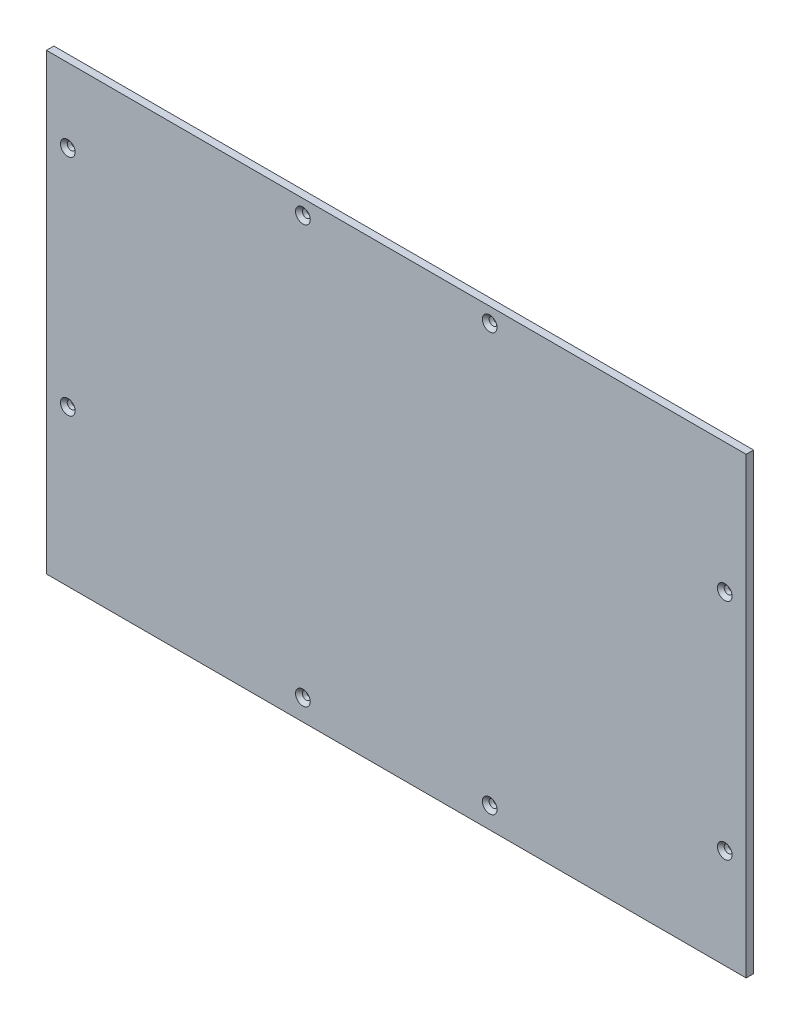
ISO-10303-21;
HEADER;
FILE_DESCRIPTION(('STEP AP214'),'2;1');
FILE_NAME('part.step','',(''),(''),'','','');
FILE_SCHEMA(('AUTOMOTIVE_DESIGN { 1 0 10303 214 1 1 1 1 }'));
ENDSEC;
DATA;
#1=APPLICATION_CONTEXT('core data for automotive mechanical design processes');
#2=APPLICATION_PROTOCOL_DEFINITION('international standard','automotive_design',2000,#1);
#3=PRODUCT_CONTEXT('',#1,'mechanical');
#4=PRODUCT('Part','Part','',(#3));
#5=PRODUCT_RELATED_PRODUCT_CATEGORY('part','',(#4));
#6=PRODUCT_DEFINITION_FORMATION('','',#4);
#7=PRODUCT_DEFINITION_CONTEXT('part definition',#1,'design');
#8=PRODUCT_DEFINITION('design','',#6,#7);
#9=PRODUCT_DEFINITION_SHAPE('','',#8);
#10=(LENGTH_UNIT() NAMED_UNIT(*) SI_UNIT(.MILLI.,.METRE.));
#11=(NAMED_UNIT(*) PLANE_ANGLE_UNIT() SI_UNIT($,.RADIAN.));
#12=(NAMED_UNIT(*) SI_UNIT($,.STERADIAN.) SOLID_ANGLE_UNIT());
#13=UNCERTAINTY_MEASURE_WITH_UNIT(LENGTH_MEASURE(1.E-05),#10,'distance_accuracy_value','');
#14=(GEOMETRIC_REPRESENTATION_CONTEXT(3) GLOBAL_UNCERTAINTY_ASSIGNED_CONTEXT((#13)) GLOBAL_UNIT_ASSIGNED_CONTEXT((#10,
#11,#12)) REPRESENTATION_CONTEXT('',''));
#15=CARTESIAN_POINT('',(0.,0.,0.));
#16=DIRECTION('',(0.,0.,1.));
#17=DIRECTION('',(1.,0.,0.));
#18=AXIS2_PLACEMENT_3D('',#15,#16,#17);
#19=CARTESIAN_POINT('',(-149.85,0.,3.175));
#20=DIRECTION('',(1.,0.,0.));
#21=DIRECTION('',(0.,1.,0.));
#22=AXIS2_PLACEMENT_3D('',#19,#20,#21);
#23=PLANE('',#22);
#24=DIRECTION('',(0.,-1.,0.));
#25=VECTOR('',#24,1.);
#26=CARTESIAN_POINT('',(-149.85,0.,0.));
#27=LINE('',#26,#25);
#28=CARTESIAN_POINT('',(-149.85,97.125,0.));
#29=VERTEX_POINT('',#28);
#30=CARTESIAN_POINT('',(-149.85,-97.125,0.));
#31=VERTEX_POINT('',#30);
#32=EDGE_CURVE('E108',#29,#31,#27,.T.);
#33=ORIENTED_EDGE('',*,*,#32,.T.);
#34=DIRECTION('',(0.,0.,-1.));
#35=VECTOR('',#34,1.);
#36=CARTESIAN_POINT('',(-149.85,-97.125,3.175));
#37=LINE('',#36,#35);
#38=CARTESIAN_POINT('',(-149.85,-97.125,3.175));
#39=VERTEX_POINT('',#38);
#40=EDGE_CURVE('E11',#39,#31,#37,.T.);
#41=ORIENTED_EDGE('',*,*,#40,.F.);
#42=DIRECTION('',(0.,-1.,0.));
#43=VECTOR('',#42,1.);
#44=CARTESIAN_POINT('',(-149.85,0.,3.175));
#45=LINE('',#44,#43);
#46=CARTESIAN_POINT('',(-149.85,97.125,3.175));
#47=VERTEX_POINT('',#46);
#48=EDGE_CURVE('E94',#47,#39,#45,.T.);
#49=ORIENTED_EDGE('',*,*,#48,.F.);
#50=DIRECTION('',(0.,0.,-1.));
#51=VECTOR('',#50,1.);
#52=CARTESIAN_POINT('',(-149.85,97.125,3.175));
#53=LINE('',#52,#51);
#54=EDGE_CURVE('E61',#47,#29,#53,.T.);
#55=ORIENTED_EDGE('',*,*,#54,.T.);
#56=EDGE_LOOP('',(#33,#41,#49,#55));
#57=FACE_BOUND('',#56,.T.);
#58=ADVANCED_FACE('F45',(#57),#23,.F.);
#59=CARTESIAN_POINT('',(0.,-97.125,3.175));
#60=DIRECTION('',(0.,1.,0.));
#61=DIRECTION('',(0.,0.,1.));
#62=AXIS2_PLACEMENT_3D('',#59,#60,#61);
#63=PLANE('',#62);
#64=DIRECTION('',(1.,0.,0.));
#65=VECTOR('',#64,1.);
#66=CARTESIAN_POINT('',(0.,-97.125,0.));
#67=LINE('',#66,#65);
#68=CARTESIAN_POINT('',(149.85,-97.125,0.));
#69=VERTEX_POINT('',#68);
#70=EDGE_CURVE('E99',#31,#69,#67,.T.);
#71=ORIENTED_EDGE('',*,*,#70,.T.);
#72=DIRECTION('',(0.,0.,-1.));
#73=VECTOR('',#72,1.);
#74=CARTESIAN_POINT('',(149.85,-97.125,3.175));
#75=LINE('',#74,#73);
#76=CARTESIAN_POINT('',(149.85,-97.125,3.175));
#77=VERTEX_POINT('',#76);
#78=EDGE_CURVE('E53',#77,#69,#75,.T.);
#79=ORIENTED_EDGE('',*,*,#78,.F.);
#80=DIRECTION('',(1.,0.,0.));
#81=VECTOR('',#80,1.);
#82=CARTESIAN_POINT('',(0.,-97.125,3.175));
#83=LINE('',#82,#81);
#84=EDGE_CURVE('E86',#39,#77,#83,.T.);
#85=ORIENTED_EDGE('',*,*,#84,.F.);
#86=ORIENTED_EDGE('',*,*,#40,.T.);
#87=EDGE_LOOP('',(#71,#79,#85,#86));
#88=FACE_BOUND('',#87,.T.);
#89=ADVANCED_FACE('F98',(#88),#63,.F.);
#90=CARTESIAN_POINT('',(149.85,0.,3.175));
#91=DIRECTION('',(1.,0.,0.));
#92=DIRECTION('',(0.,1.,0.));
#93=AXIS2_PLACEMENT_3D('',#90,#91,#92);
#94=PLANE('',#93);
#95=DIRECTION('',(0.,-1.,0.));
#96=VECTOR('',#95,1.);
#97=CARTESIAN_POINT('',(149.85,0.,0.));
#98=LINE('',#97,#96);
#99=CARTESIAN_POINT('',(149.85,97.125,0.));
#100=VERTEX_POINT('',#99);
#101=EDGE_CURVE('E112',#100,#69,#98,.T.);
#102=ORIENTED_EDGE('',*,*,#101,.F.);
#103=DIRECTION('',(0.,0.,-1.));
#104=VECTOR('',#103,1.);
#105=CARTESIAN_POINT('',(149.85,97.125,3.175));
#106=LINE('',#105,#104);
#107=CARTESIAN_POINT('',(149.85,97.125,3.175));
#108=VERTEX_POINT('',#107);
#109=EDGE_CURVE('E75',#108,#100,#106,.T.);
#110=ORIENTED_EDGE('',*,*,#109,.F.);
#111=DIRECTION('',(0.,-1.,0.));
#112=VECTOR('',#111,1.);
#113=CARTESIAN_POINT('',(149.85,0.,3.175));
#114=LINE('',#113,#112);
#115=EDGE_CURVE('E93',#108,#77,#114,.T.);
#116=ORIENTED_EDGE('',*,*,#115,.T.);
#117=ORIENTED_EDGE('',*,*,#78,.T.);
#118=EDGE_LOOP('',(#102,#110,#116,#117));
#119=FACE_BOUND('',#118,.T.);
#120=ADVANCED_FACE('F102',(#119),#94,.T.);
#121=CARTESIAN_POINT('',(0.,97.125,3.175));
#122=DIRECTION('',(0.,1.,0.));
#123=DIRECTION('',(0.,0.,1.));
#124=AXIS2_PLACEMENT_3D('',#121,#122,#123);
#125=PLANE('',#124);
#126=DIRECTION('',(1.,0.,0.));
#127=VECTOR('',#126,1.);
#128=CARTESIAN_POINT('',(0.,97.125,0.));
#129=LINE('',#128,#127);
#130=EDGE_CURVE('E114',#29,#100,#129,.T.);
#131=ORIENTED_EDGE('',*,*,#130,.F.);
#132=ORIENTED_EDGE('',*,*,#54,.F.);
#133=DIRECTION('',(1.,0.,0.));
#134=VECTOR('',#133,1.);
#135=CARTESIAN_POINT('',(0.,97.125,3.175));
#136=LINE('',#135,#134);
#137=EDGE_CURVE('E103',#47,#108,#136,.T.);
#138=ORIENTED_EDGE('',*,*,#137,.T.);
#139=ORIENTED_EDGE('',*,*,#109,.T.);
#140=EDGE_LOOP('',(#131,#132,#138,#139));
#141=FACE_BOUND('',#140,.T.);
#142=ADVANCED_FACE('F197',(#141),#125,.T.);
#143=CARTESIAN_POINT('',(0.,0.,3.175));
#144=DIRECTION('',(0.,0.,1.));
#145=DIRECTION('',(1.,0.,0.));
#146=AXIS2_PLACEMENT_3D('',#143,#144,#145);
#147=PLANE('',#146);
#148=CARTESIAN_POINT('',(-40.0000000000012,90.7750000520013,3.175));
#149=DIRECTION('',(0.,0.,1.));
#150=DIRECTION('',(1.,0.,0.));
#151=AXIS2_PLACEMENT_3D('',#148,#149,#150);
#152=CIRCLE('',#151,3.15);
#153=CARTESIAN_POINT('',(-36.8500000000012,90.7750000520013,3.175));
#154=VERTEX_POINT('',#153);
#155=EDGE_CURVE('E188',#154,#154,#152,.T.);
#156=ORIENTED_EDGE('',*,*,#155,.F.);
#157=EDGE_LOOP('',(#156));
#158=FACE_BOUND('',#157,.T.);
#159=CARTESIAN_POINT('',(140.687500033,41.4750000519999,3.175));
#160=DIRECTION('',(0.,0.,1.));
#161=DIRECTION('',(1.,0.,0.));
#162=AXIS2_PLACEMENT_3D('',#159,#160,#161);
#163=CIRCLE('',#162,3.15000000000001);
#164=CARTESIAN_POINT('',(143.837500033,41.4750000519999,3.175));
#165=VERTEX_POINT('',#164);
#166=EDGE_CURVE('E179',#165,#165,#163,.T.);
#167=ORIENTED_EDGE('',*,*,#166,.F.);
#168=EDGE_LOOP('',(#167));
#169=FACE_BOUND('',#168,.T.);
#170=CARTESIAN_POINT('',(140.687500033,-54.5249999480001,3.175));
#171=DIRECTION('',(0.,0.,1.));
#172=DIRECTION('',(1.,0.,0.));
#173=AXIS2_PLACEMENT_3D('',#170,#171,#172);
#174=CIRCLE('',#173,3.15000000000001);
#175=CARTESIAN_POINT('',(143.837500033,-54.5249999480001,3.175));
#176=VERTEX_POINT('',#175);
#177=EDGE_CURVE('E170',#176,#176,#174,.T.);
#178=ORIENTED_EDGE('',*,*,#177,.F.);
#179=EDGE_LOOP('',(#178));
#180=FACE_BOUND('',#179,.T.);
#181=CARTESIAN_POINT('',(39.9999999999992,-88.0307499479999,3.175));
#182=DIRECTION('',(0.,0.,1.));
#183=DIRECTION('',(1.,0.,0.));
#184=AXIS2_PLACEMENT_3D('',#181,#182,#183);
#185=CIRCLE('',#184,3.15);
#186=CARTESIAN_POINT('',(43.1499999999992,-88.0307499479999,3.175));
#187=VERTEX_POINT('',#186);
#188=EDGE_CURVE('E161',#187,#187,#185,.T.);
#189=ORIENTED_EDGE('',*,*,#188,.F.);
#190=EDGE_LOOP('',(#189));
#191=FACE_BOUND('',#190,.T.);
#192=CARTESIAN_POINT('',(-40.0000000000013,-88.0307499479999,3.175));
#193=DIRECTION('',(0.,0.,1.));
#194=DIRECTION('',(1.,0.,0.));
#195=AXIS2_PLACEMENT_3D('',#192,#193,#194);
#196=CIRCLE('',#195,3.15);
#197=CARTESIAN_POINT('',(-36.8500000000013,-88.0307499479999,3.175));
#198=VERTEX_POINT('',#197);
#199=EDGE_CURVE('E152',#198,#198,#196,.T.);
#200=ORIENTED_EDGE('',*,*,#199,.F.);
#201=EDGE_LOOP('',(#200));
#202=FACE_BOUND('',#201,.T.);
#203=CARTESIAN_POINT('',(-140.687500033,-30.5249999479999,3.175));
#204=DIRECTION('',(0.,0.,1.));
#205=DIRECTION('',(1.,0.,0.));
#206=AXIS2_PLACEMENT_3D('',#203,#204,#205);
#207=CIRCLE('',#206,3.15000000000001);
#208=CARTESIAN_POINT('',(-137.537500033,-30.5249999479999,3.175));
#209=VERTEX_POINT('',#208);
#210=EDGE_CURVE('E143',#209,#209,#207,.T.);
#211=ORIENTED_EDGE('',*,*,#210,.F.);
#212=EDGE_LOOP('',(#211));
#213=FACE_BOUND('',#212,.T.);
#214=CARTESIAN_POINT('',(-140.687500033,65.475000052,3.175));
#215=DIRECTION('',(0.,0.,1.));
#216=DIRECTION('',(1.,0.,0.));
#217=AXIS2_PLACEMENT_3D('',#214,#215,#216);
#218=CIRCLE('',#217,3.15000000000001);
#219=CARTESIAN_POINT('',(-137.537500033,65.475000052,3.175));
#220=VERTEX_POINT('',#219);
#221=EDGE_CURVE('E134',#220,#220,#218,.T.);
#222=ORIENTED_EDGE('',*,*,#221,.F.);
#223=EDGE_LOOP('',(#222));
#224=FACE_BOUND('',#223,.T.);
#225=CARTESIAN_POINT('',(39.9999999999993,90.7750000520013,3.175));
#226=DIRECTION('',(0.,0.,1.));
#227=DIRECTION('',(1.,0.,0.));
#228=AXIS2_PLACEMENT_3D('',#225,#226,#227);
#229=CIRCLE('',#228,3.15);
#230=CARTESIAN_POINT('',(43.1499999999993,90.7750000520013,3.175));
#231=VERTEX_POINT('',#230);
#232=EDGE_CURVE('E125',#231,#231,#229,.T.);
#233=ORIENTED_EDGE('',*,*,#232,.F.);
#234=EDGE_LOOP('',(#233));
#235=FACE_BOUND('',#234,.T.);
#236=ORIENTED_EDGE('',*,*,#48,.T.);
#237=ORIENTED_EDGE('',*,*,#84,.T.);
#238=ORIENTED_EDGE('',*,*,#115,.F.);
#239=ORIENTED_EDGE('',*,*,#137,.F.);
#240=EDGE_LOOP('',(#236,#237,#238,#239));
#241=FACE_BOUND('',#240,.T.);
#242=ADVANCED_FACE('F90',(#158,#169,#180,#191,#202,#213,#224,#235,#241),#147,.T.);
#243=CARTESIAN_POINT('',(0.,0.,0.));
#244=DIRECTION('',(0.,0.,1.));
#245=DIRECTION('',(1.,0.,0.));
#246=AXIS2_PLACEMENT_3D('',#243,#244,#245);
#247=PLANE('',#246);
#248=CARTESIAN_POINT('',(-40.0000000000012,90.7750000520013,0.));
#249=DIRECTION('',(0.,0.,1.));
#250=DIRECTION('',(1.,0.,0.));
#251=AXIS2_PLACEMENT_3D('',#248,#249,#250);
#252=CIRCLE('',#251,1.7);
#253=CARTESIAN_POINT('',(-38.3000000000012,90.7750000520013,0.));
#254=VERTEX_POINT('',#253);
#255=EDGE_CURVE('E182',#254,#254,#252,.T.);
#256=ORIENTED_EDGE('',*,*,#255,.T.);
#257=EDGE_LOOP('',(#256));
#258=FACE_BOUND('',#257,.T.);
#259=CARTESIAN_POINT('',(140.687500033,41.4750000519999,0.));
#260=DIRECTION('',(0.,0.,1.));
#261=DIRECTION('',(1.,0.,0.));
#262=AXIS2_PLACEMENT_3D('',#259,#260,#261);
#263=CIRCLE('',#262,1.70000000000001);
#264=CARTESIAN_POINT('',(142.387500033,41.4750000519999,0.));
#265=VERTEX_POINT('',#264);
#266=EDGE_CURVE('E173',#265,#265,#263,.T.);
#267=ORIENTED_EDGE('',*,*,#266,.T.);
#268=EDGE_LOOP('',(#267));
#269=FACE_BOUND('',#268,.T.);
#270=CARTESIAN_POINT('',(140.687500033,-54.5249999480001,0.));
#271=DIRECTION('',(0.,0.,1.));
#272=DIRECTION('',(1.,0.,0.));
#273=AXIS2_PLACEMENT_3D('',#270,#271,#272);
#274=CIRCLE('',#273,1.70000000000001);
#275=CARTESIAN_POINT('',(142.387500033,-54.5249999480001,0.));
#276=VERTEX_POINT('',#275);
#277=EDGE_CURVE('E164',#276,#276,#274,.T.);
#278=ORIENTED_EDGE('',*,*,#277,.T.);
#279=EDGE_LOOP('',(#278));
#280=FACE_BOUND('',#279,.T.);
#281=CARTESIAN_POINT('',(39.9999999999992,-88.0307499479999,0.));
#282=DIRECTION('',(0.,0.,1.));
#283=DIRECTION('',(1.,0.,0.));
#284=AXIS2_PLACEMENT_3D('',#281,#282,#283);
#285=CIRCLE('',#284,1.7);
#286=CARTESIAN_POINT('',(41.6999999999992,-88.0307499479999,0.));
#287=VERTEX_POINT('',#286);
#288=EDGE_CURVE('E155',#287,#287,#285,.T.);
#289=ORIENTED_EDGE('',*,*,#288,.T.);
#290=EDGE_LOOP('',(#289));
#291=FACE_BOUND('',#290,.T.);
#292=CARTESIAN_POINT('',(-40.0000000000013,-88.0307499479999,0.));
#293=DIRECTION('',(0.,0.,1.));
#294=DIRECTION('',(1.,0.,0.));
#295=AXIS2_PLACEMENT_3D('',#292,#293,#294);
#296=CIRCLE('',#295,1.7);
#297=CARTESIAN_POINT('',(-38.3000000000013,-88.0307499479999,0.));
#298=VERTEX_POINT('',#297);
#299=EDGE_CURVE('E146',#298,#298,#296,.T.);
#300=ORIENTED_EDGE('',*,*,#299,.T.);
#301=EDGE_LOOP('',(#300));
#302=FACE_BOUND('',#301,.T.);
#303=CARTESIAN_POINT('',(-140.687500033,-30.5249999479999,0.));
#304=DIRECTION('',(0.,0.,1.));
#305=DIRECTION('',(1.,0.,0.));
#306=AXIS2_PLACEMENT_3D('',#303,#304,#305);
#307=CIRCLE('',#306,1.70000000000001);
#308=CARTESIAN_POINT('',(-138.987500033,-30.5249999479999,0.));
#309=VERTEX_POINT('',#308);
#310=EDGE_CURVE('E137',#309,#309,#307,.T.);
#311=ORIENTED_EDGE('',*,*,#310,.T.);
#312=EDGE_LOOP('',(#311));
#313=FACE_BOUND('',#312,.T.);
#314=CARTESIAN_POINT('',(-140.687500033,65.475000052,0.));
#315=DIRECTION('',(0.,0.,1.));
#316=DIRECTION('',(1.,0.,0.));
#317=AXIS2_PLACEMENT_3D('',#314,#315,#316);
#318=CIRCLE('',#317,1.70000000000001);
#319=CARTESIAN_POINT('',(-138.987500033,65.475000052,0.));
#320=VERTEX_POINT('',#319);
#321=EDGE_CURVE('E128',#320,#320,#318,.T.);
#322=ORIENTED_EDGE('',*,*,#321,.T.);
#323=EDGE_LOOP('',(#322));
#324=FACE_BOUND('',#323,.T.);
#325=CARTESIAN_POINT('',(39.9999999999993,90.7750000520013,0.));
#326=DIRECTION('',(0.,0.,1.));
#327=DIRECTION('',(1.,0.,0.));
#328=AXIS2_PLACEMENT_3D('',#325,#326,#327);
#329=CIRCLE('',#328,1.7);
#330=CARTESIAN_POINT('',(41.6999999999993,90.7750000520013,0.));
#331=VERTEX_POINT('',#330);
#332=EDGE_CURVE('E110',#331,#331,#329,.T.);
#333=ORIENTED_EDGE('',*,*,#332,.T.);
#334=EDGE_LOOP('',(#333));
#335=FACE_BOUND('',#334,.T.);
#336=ORIENTED_EDGE('',*,*,#32,.F.);
#337=ORIENTED_EDGE('',*,*,#130,.T.);
#338=ORIENTED_EDGE('',*,*,#101,.T.);
#339=ORIENTED_EDGE('',*,*,#70,.F.);
#340=EDGE_LOOP('',(#336,#337,#338,#339));
#341=FACE_BOUND('',#340,.T.);
#342=ADVANCED_FACE('F196',(#258,#269,#280,#291,#302,#313,#324,#335,#341),#247,.F.);
#343=CARTESIAN_POINT('',(39.9999999999993,90.7750000520013,3.175));
#344=DIRECTION('',(0.,0.,1.));
#345=DIRECTION('',(1.,0.,0.));
#346=AXIS2_PLACEMENT_3D('',#343,#344,#345);
#347=CYLINDRICAL_SURFACE('',#346,1.7);
#348=ORIENTED_EDGE('',*,*,#332,.F.);
#349=EDGE_LOOP('',(#348));
#350=FACE_BOUND('',#349,.T.);
#351=CARTESIAN_POINT('',(39.9999999999993,90.7750000520013,1.725));
#352=DIRECTION('',(0.,0.,1.));
#353=DIRECTION('',(1.,0.,0.));
#354=AXIS2_PLACEMENT_3D('',#351,#352,#353);
#355=CIRCLE('',#354,1.7);
#356=CARTESIAN_POINT('',(41.6999999999993,90.7750000520013,1.725));
#357=VERTEX_POINT('',#356);
#358=EDGE_CURVE('E122',#357,#357,#355,.T.);
#359=ORIENTED_EDGE('',*,*,#358,.T.);
#360=EDGE_LOOP('',(#359));
#361=FACE_BOUND('',#360,.T.);
#362=ADVANCED_FACE('F216',(#350,#361),#347,.F.);
#363=CARTESIAN_POINT('',(39.9999999999993,90.7750000520013,3.175));
#364=DIRECTION('',(0.,0.,1.));
#365=DIRECTION('',(1.,0.,0.));
#366=AXIS2_PLACEMENT_3D('',#363,#364,#365);
#367=CONICAL_SURFACE('',#366,3.15,0.785398163397447);
#368=ORIENTED_EDGE('',*,*,#358,.F.);
#369=EDGE_LOOP('',(#368));
#370=FACE_BOUND('',#369,.T.);
#371=ORIENTED_EDGE('',*,*,#232,.T.);
#372=EDGE_LOOP('',(#371));
#373=FACE_BOUND('',#372,.T.);
#374=ADVANCED_FACE('F213',(#370,#373),#367,.F.);
#375=CARTESIAN_POINT('',(-140.687500033,65.475000052,3.175));
#376=DIRECTION('',(0.,0.,1.));
#377=DIRECTION('',(1.,0.,0.));
#378=AXIS2_PLACEMENT_3D('',#375,#376,#377);
#379=CYLINDRICAL_SURFACE('',#378,1.70000000000001);
#380=ORIENTED_EDGE('',*,*,#321,.F.);
#381=EDGE_LOOP('',(#380));
#382=FACE_BOUND('',#381,.T.);
#383=CARTESIAN_POINT('',(-140.687500033,65.475000052,1.725));
#384=DIRECTION('',(0.,0.,1.));
#385=DIRECTION('',(1.,0.,0.));
#386=AXIS2_PLACEMENT_3D('',#383,#384,#385);
#387=CIRCLE('',#386,1.70000000000001);
#388=CARTESIAN_POINT('',(-138.987500033,65.475000052,1.725));
#389=VERTEX_POINT('',#388);
#390=EDGE_CURVE('E131',#389,#389,#387,.T.);
#391=ORIENTED_EDGE('',*,*,#390,.T.);
#392=EDGE_LOOP('',(#391));
#393=FACE_BOUND('',#392,.T.);
#394=ADVANCED_FACE('F215',(#382,#393),#379,.F.);
#395=CARTESIAN_POINT('',(-140.687500033,65.475000052,3.175));
#396=DIRECTION('',(0.,0.,1.));
#397=DIRECTION('',(1.,0.,0.));
#398=AXIS2_PLACEMENT_3D('',#395,#396,#397);
#399=CONICAL_SURFACE('',#398,3.15000000000001,0.78539816339745);
#400=ORIENTED_EDGE('',*,*,#390,.F.);
#401=EDGE_LOOP('',(#400));
#402=FACE_BOUND('',#401,.T.);
#403=ORIENTED_EDGE('',*,*,#221,.T.);
#404=EDGE_LOOP('',(#403));
#405=FACE_BOUND('',#404,.T.);
#406=ADVANCED_FACE('F223',(#402,#405),#399,.F.);
#407=CARTESIAN_POINT('',(-140.687500033,-30.5249999479999,3.175));
#408=DIRECTION('',(0.,0.,1.));
#409=DIRECTION('',(1.,0.,0.));
#410=AXIS2_PLACEMENT_3D('',#407,#408,#409);
#411=CYLINDRICAL_SURFACE('',#410,1.70000000000001);
#412=ORIENTED_EDGE('',*,*,#310,.F.);
#413=EDGE_LOOP('',(#412));
#414=FACE_BOUND('',#413,.T.);
#415=CARTESIAN_POINT('',(-140.687500033,-30.5249999479999,1.725));
#416=DIRECTION('',(0.,0.,1.));
#417=DIRECTION('',(1.,0.,0.));
#418=AXIS2_PLACEMENT_3D('',#415,#416,#417);
#419=CIRCLE('',#418,1.70000000000001);
#420=CARTESIAN_POINT('',(-138.987500033,-30.5249999479999,1.725));
#421=VERTEX_POINT('',#420);
#422=EDGE_CURVE('E140',#421,#421,#419,.T.);
#423=ORIENTED_EDGE('',*,*,#422,.T.);
#424=EDGE_LOOP('',(#423));
#425=FACE_BOUND('',#424,.T.);
#426=ADVANCED_FACE('F265',(#414,#425),#411,.F.);
#427=CARTESIAN_POINT('',(-140.687500033,-30.5249999479999,3.175));
#428=DIRECTION('',(0.,0.,1.));
#429=DIRECTION('',(1.,0.,0.));
#430=AXIS2_PLACEMENT_3D('',#427,#428,#429);
#431=CONICAL_SURFACE('',#430,3.15000000000001,0.78539816339745);
#432=ORIENTED_EDGE('',*,*,#422,.F.);
#433=EDGE_LOOP('',(#432));
#434=FACE_BOUND('',#433,.T.);
#435=ORIENTED_EDGE('',*,*,#210,.T.);
#436=EDGE_LOOP('',(#435));
#437=FACE_BOUND('',#436,.T.);
#438=ADVANCED_FACE('F270',(#434,#437),#431,.F.);
#439=CARTESIAN_POINT('',(-40.0000000000013,-88.0307499479999,3.175));
#440=DIRECTION('',(0.,0.,1.));
#441=DIRECTION('',(1.,0.,0.));
#442=AXIS2_PLACEMENT_3D('',#439,#440,#441);
#443=CYLINDRICAL_SURFACE('',#442,1.7);
#444=ORIENTED_EDGE('',*,*,#299,.F.);
#445=EDGE_LOOP('',(#444));
#446=FACE_BOUND('',#445,.T.);
#447=CARTESIAN_POINT('',(-40.0000000000013,-88.0307499479999,1.725));
#448=DIRECTION('',(0.,0.,1.));
#449=DIRECTION('',(1.,0.,0.));
#450=AXIS2_PLACEMENT_3D('',#447,#448,#449);
#451=CIRCLE('',#450,1.7);
#452=CARTESIAN_POINT('',(-38.3000000000013,-88.0307499479999,1.725));
#453=VERTEX_POINT('',#452);
#454=EDGE_CURVE('E149',#453,#453,#451,.T.);
#455=ORIENTED_EDGE('',*,*,#454,.T.);
#456=EDGE_LOOP('',(#455));
#457=FACE_BOUND('',#456,.T.);
#458=ADVANCED_FACE('F276',(#446,#457),#443,.F.);
#459=CARTESIAN_POINT('',(-40.0000000000013,-88.0307499479999,3.175));
#460=DIRECTION('',(0.,0.,1.));
#461=DIRECTION('',(1.,0.,0.));
#462=AXIS2_PLACEMENT_3D('',#459,#460,#461);
#463=CONICAL_SURFACE('',#462,3.15,0.785398163397447);
#464=ORIENTED_EDGE('',*,*,#454,.F.);
#465=EDGE_LOOP('',(#464));
#466=FACE_BOUND('',#465,.T.);
#467=ORIENTED_EDGE('',*,*,#199,.T.);
#468=EDGE_LOOP('',(#467));
#469=FACE_BOUND('',#468,.T.);
#470=ADVANCED_FACE('F280',(#466,#469),#463,.F.);
#471=CARTESIAN_POINT('',(39.9999999999992,-88.0307499479999,3.175));
#472=DIRECTION('',(0.,0.,1.));
#473=DIRECTION('',(1.,0.,0.));
#474=AXIS2_PLACEMENT_3D('',#471,#472,#473);
#475=CYLINDRICAL_SURFACE('',#474,1.7);
#476=ORIENTED_EDGE('',*,*,#288,.F.);
#477=EDGE_LOOP('',(#476));
#478=FACE_BOUND('',#477,.T.);
#479=CARTESIAN_POINT('',(39.9999999999992,-88.0307499479999,1.725));
#480=DIRECTION('',(0.,0.,1.));
#481=DIRECTION('',(1.,0.,0.));
#482=AXIS2_PLACEMENT_3D('',#479,#480,#481);
#483=CIRCLE('',#482,1.7);
#484=CARTESIAN_POINT('',(41.6999999999992,-88.0307499479999,1.725));
#485=VERTEX_POINT('',#484);
#486=EDGE_CURVE('E158',#485,#485,#483,.T.);
#487=ORIENTED_EDGE('',*,*,#486,.T.);
#488=EDGE_LOOP('',(#487));
#489=FACE_BOUND('',#488,.T.);
#490=ADVANCED_FACE('F284',(#478,#489),#475,.F.);
#491=CARTESIAN_POINT('',(39.9999999999992,-88.0307499479999,3.175));
#492=DIRECTION('',(0.,0.,1.));
#493=DIRECTION('',(1.,0.,0.));
#494=AXIS2_PLACEMENT_3D('',#491,#492,#493);
#495=CONICAL_SURFACE('',#494,3.15,0.785398163397447);
#496=ORIENTED_EDGE('',*,*,#486,.F.);
#497=EDGE_LOOP('',(#496));
#498=FACE_BOUND('',#497,.T.);
#499=ORIENTED_EDGE('',*,*,#188,.T.);
#500=EDGE_LOOP('',(#499));
#501=FACE_BOUND('',#500,.T.);
#502=ADVANCED_FACE('F288',(#498,#501),#495,.F.);
#503=CARTESIAN_POINT('',(140.687500033,-54.5249999480001,3.175));
#504=DIRECTION('',(0.,0.,1.));
#505=DIRECTION('',(1.,0.,0.));
#506=AXIS2_PLACEMENT_3D('',#503,#504,#505);
#507=CYLINDRICAL_SURFACE('',#506,1.70000000000001);
#508=ORIENTED_EDGE('',*,*,#277,.F.);
#509=EDGE_LOOP('',(#508));
#510=FACE_BOUND('',#509,.T.);
#511=CARTESIAN_POINT('',(140.687500033,-54.5249999480001,1.725));
#512=DIRECTION('',(0.,0.,1.));
#513=DIRECTION('',(1.,0.,0.));
#514=AXIS2_PLACEMENT_3D('',#511,#512,#513);
#515=CIRCLE('',#514,1.70000000000001);
#516=CARTESIAN_POINT('',(142.387500033,-54.5249999480001,1.725));
#517=VERTEX_POINT('',#516);
#518=EDGE_CURVE('E167',#517,#517,#515,.T.);
#519=ORIENTED_EDGE('',*,*,#518,.T.);
#520=EDGE_LOOP('',(#519));
#521=FACE_BOUND('',#520,.T.);
#522=ADVANCED_FACE('F292',(#510,#521),#507,.F.);
#523=CARTESIAN_POINT('',(140.687500033,-54.5249999480001,3.175));
#524=DIRECTION('',(0.,0.,1.));
#525=DIRECTION('',(1.,0.,0.));
#526=AXIS2_PLACEMENT_3D('',#523,#524,#525);
#527=CONICAL_SURFACE('',#526,3.15000000000001,0.78539816339745);
#528=ORIENTED_EDGE('',*,*,#518,.F.);
#529=EDGE_LOOP('',(#528));
#530=FACE_BOUND('',#529,.T.);
#531=ORIENTED_EDGE('',*,*,#177,.T.);
#532=EDGE_LOOP('',(#531));
#533=FACE_BOUND('',#532,.T.);
#534=ADVANCED_FACE('F296',(#530,#533),#527,.F.);
#535=CARTESIAN_POINT('',(140.687500033,41.4750000519999,3.175));
#536=DIRECTION('',(0.,0.,1.));
#537=DIRECTION('',(1.,0.,0.));
#538=AXIS2_PLACEMENT_3D('',#535,#536,#537);
#539=CYLINDRICAL_SURFACE('',#538,1.70000000000001);
#540=ORIENTED_EDGE('',*,*,#266,.F.);
#541=EDGE_LOOP('',(#540));
#542=FACE_BOUND('',#541,.T.);
#543=CARTESIAN_POINT('',(140.687500033,41.4750000519999,1.725));
#544=DIRECTION('',(0.,0.,1.));
#545=DIRECTION('',(1.,0.,0.));
#546=AXIS2_PLACEMENT_3D('',#543,#544,#545);
#547=CIRCLE('',#546,1.70000000000001);
#548=CARTESIAN_POINT('',(142.387500033,41.4750000519999,1.725));
#549=VERTEX_POINT('',#548);
#550=EDGE_CURVE('E176',#549,#549,#547,.T.);
#551=ORIENTED_EDGE('',*,*,#550,.T.);
#552=EDGE_LOOP('',(#551));
#553=FACE_BOUND('',#552,.T.);
#554=ADVANCED_FACE('F300',(#542,#553),#539,.F.);
#555=CARTESIAN_POINT('',(140.687500033,41.4750000519999,3.175));
#556=DIRECTION('',(0.,0.,1.));
#557=DIRECTION('',(1.,0.,0.));
#558=AXIS2_PLACEMENT_3D('',#555,#556,#557);
#559=CONICAL_SURFACE('',#558,3.15000000000001,0.78539816339745);
#560=ORIENTED_EDGE('',*,*,#550,.F.);
#561=EDGE_LOOP('',(#560));
#562=FACE_BOUND('',#561,.T.);
#563=ORIENTED_EDGE('',*,*,#166,.T.);
#564=EDGE_LOOP('',(#563));
#565=FACE_BOUND('',#564,.T.);
#566=ADVANCED_FACE('F304',(#562,#565),#559,.F.);
#567=CARTESIAN_POINT('',(-40.0000000000012,90.7750000520013,3.175));
#568=DIRECTION('',(0.,0.,1.));
#569=DIRECTION('',(1.,0.,0.));
#570=AXIS2_PLACEMENT_3D('',#567,#568,#569);
#571=CYLINDRICAL_SURFACE('',#570,1.7);
#572=ORIENTED_EDGE('',*,*,#255,.F.);
#573=EDGE_LOOP('',(#572));
#574=FACE_BOUND('',#573,.T.);
#575=CARTESIAN_POINT('',(-40.0000000000012,90.7750000520013,1.725));
#576=DIRECTION('',(0.,0.,1.));
#577=DIRECTION('',(1.,0.,0.));
#578=AXIS2_PLACEMENT_3D('',#575,#576,#577);
#579=CIRCLE('',#578,1.7);
#580=CARTESIAN_POINT('',(-38.3000000000012,90.7750000520013,1.725));
#581=VERTEX_POINT('',#580);
#582=EDGE_CURVE('E185',#581,#581,#579,.T.);
#583=ORIENTED_EDGE('',*,*,#582,.T.);
#584=EDGE_LOOP('',(#583));
#585=FACE_BOUND('',#584,.T.);
#586=ADVANCED_FACE('F308',(#574,#585),#571,.F.);
#587=CARTESIAN_POINT('',(-40.0000000000012,90.7750000520013,3.175));
#588=DIRECTION('',(0.,0.,1.));
#589=DIRECTION('',(1.,0.,0.));
#590=AXIS2_PLACEMENT_3D('',#587,#588,#589);
#591=CONICAL_SURFACE('',#590,3.15,0.785398163397447);
#592=ORIENTED_EDGE('',*,*,#582,.F.);
#593=EDGE_LOOP('',(#592));
#594=FACE_BOUND('',#593,.T.);
#595=ORIENTED_EDGE('',*,*,#155,.T.);
#596=EDGE_LOOP('',(#595));
#597=FACE_BOUND('',#596,.T.);
#598=ADVANCED_FACE('F192',(#594,#597),#591,.F.);
#599=CLOSED_SHELL('',(#58,#89,#120,#142,#242,#342,#362,#374,#394,#406,#426,#438,#458,#470,#490,
#502,#522,#534,#554,#566,#586,#598));
#600=MANIFOLD_SOLID_BREP('B2',#599);
#601=ADVANCED_BREP_SHAPE_REPRESENTATION('',(#18,#600),#14);
#602=SHAPE_DEFINITION_REPRESENTATION(#9,#601);
ENDSEC;
END-ISO-10303-21;
